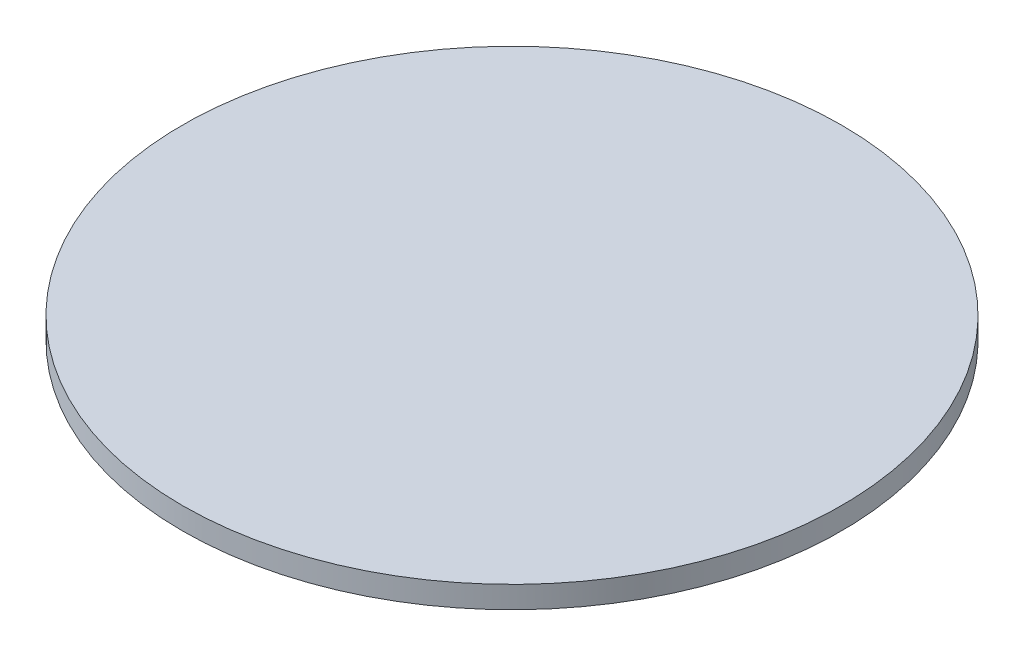
ISO-10303-21;
HEADER;
FILE_DESCRIPTION(('STEP AP214'),'2;1');
FILE_NAME('part.step','',(''),(''),'','','');
FILE_SCHEMA(('AUTOMOTIVE_DESIGN { 1 0 10303 214 1 1 1 1 }'));
ENDSEC;
DATA;
#1=APPLICATION_CONTEXT('core data for automotive mechanical design processes');
#2=APPLICATION_PROTOCOL_DEFINITION('international standard','automotive_design',2000,#1);
#3=PRODUCT_CONTEXT('',#1,'mechanical');
#4=PRODUCT('Part','Part','',(#3));
#5=PRODUCT_RELATED_PRODUCT_CATEGORY('part','',(#4));
#6=PRODUCT_DEFINITION_FORMATION('','',#4);
#7=PRODUCT_DEFINITION_CONTEXT('part definition',#1,'design');
#8=PRODUCT_DEFINITION('design','',#6,#7);
#9=PRODUCT_DEFINITION_SHAPE('','',#8);
#10=(LENGTH_UNIT() NAMED_UNIT(*) SI_UNIT(.MILLI.,.METRE.));
#11=(NAMED_UNIT(*) PLANE_ANGLE_UNIT() SI_UNIT($,.RADIAN.));
#12=(NAMED_UNIT(*) SI_UNIT($,.STERADIAN.) SOLID_ANGLE_UNIT());
#13=UNCERTAINTY_MEASURE_WITH_UNIT(LENGTH_MEASURE(1.E-05),#10,'distance_accuracy_value','');
#14=(GEOMETRIC_REPRESENTATION_CONTEXT(3) GLOBAL_UNCERTAINTY_ASSIGNED_CONTEXT((#13)) GLOBAL_UNIT_ASSIGNED_CONTEXT((#10,
#11,#12)) REPRESENTATION_CONTEXT('',''));
#15=CARTESIAN_POINT('',(0.,0.,0.));
#16=DIRECTION('',(0.,0.,1.));
#17=DIRECTION('',(1.,0.,0.));
#18=AXIS2_PLACEMENT_3D('',#15,#16,#17);
#19=CARTESIAN_POINT('',(0.,10.,0.));
#20=DIRECTION('',(0.,-1.,0.));
#21=DIRECTION('',(0.,0.,-1.));
#22=AXIS2_PLACEMENT_3D('',#19,#20,#21);
#23=CYLINDRICAL_SURFACE('',#22,150.);
#24=CARTESIAN_POINT('',(0.,10.,0.));
#25=DIRECTION('',(0.,1.,0.));
#26=DIRECTION('',(0.,0.,1.));
#27=AXIS2_PLACEMENT_3D('',#24,#25,#26);
#28=CIRCLE('',#27,150.);
#29=CARTESIAN_POINT('',(0.,10.,150.));
#30=VERTEX_POINT('',#29);
#31=EDGE_CURVE('E10',#30,#30,#28,.T.);
#32=ORIENTED_EDGE('',*,*,#31,.F.);
#33=EDGE_LOOP('',(#32));
#34=FACE_BOUND('',#33,.T.);
#35=CARTESIAN_POINT('',(0.,0.,0.));
#36=DIRECTION('',(0.,1.,0.));
#37=DIRECTION('',(0.,0.,1.));
#38=AXIS2_PLACEMENT_3D('',#35,#36,#37);
#39=CIRCLE('',#38,150.);
#40=CARTESIAN_POINT('',(0.,0.,150.));
#41=VERTEX_POINT('',#40);
#42=EDGE_CURVE('E34',#41,#41,#39,.T.);
#43=ORIENTED_EDGE('',*,*,#42,.T.);
#44=EDGE_LOOP('',(#43));
#45=FACE_BOUND('',#44,.T.);
#46=ADVANCED_FACE('F31',(#34,#45),#23,.T.);
#47=CARTESIAN_POINT('',(0.,10.,0.));
#48=DIRECTION('',(0.,1.,0.));
#49=DIRECTION('',(0.,0.,1.));
#50=AXIS2_PLACEMENT_3D('',#47,#48,#49);
#51=PLANE('',#50);
#52=ORIENTED_EDGE('',*,*,#31,.T.);
#53=EDGE_LOOP('',(#52));
#54=FACE_BOUND('',#53,.T.);
#55=ADVANCED_FACE('F46',(#54),#51,.T.);
#56=CARTESIAN_POINT('',(0.,0.,0.));
#57=DIRECTION('',(0.,1.,0.));
#58=DIRECTION('',(0.,0.,1.));
#59=AXIS2_PLACEMENT_3D('',#56,#57,#58);
#60=PLANE('',#59);
#61=ORIENTED_EDGE('',*,*,#42,.F.);
#62=EDGE_LOOP('',(#61));
#63=FACE_BOUND('',#62,.T.);
#64=ADVANCED_FACE('F44',(#63),#60,.F.);
#65=CLOSED_SHELL('',(#46,#55,#64));
#66=MANIFOLD_SOLID_BREP('B2',#65);
#67=ADVANCED_BREP_SHAPE_REPRESENTATION('',(#18,#66),#14);
#68=SHAPE_DEFINITION_REPRESENTATION(#9,#67);
ENDSEC;
END-ISO-10303-21;
